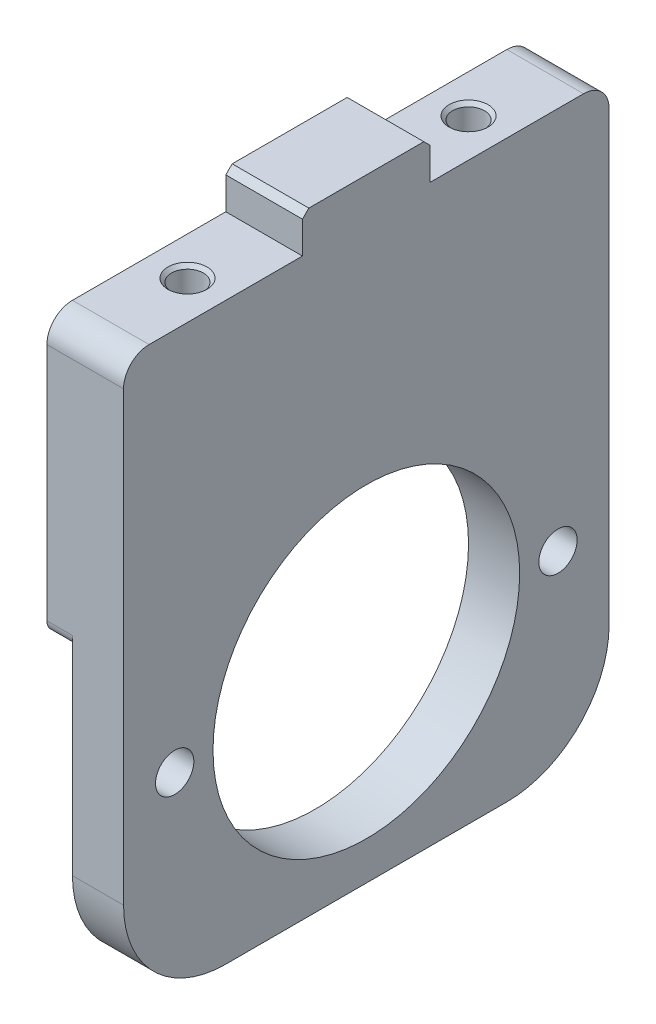
ISO-10303-21;
HEADER;
FILE_DESCRIPTION(('STEP AP214'),'2;1');
FILE_NAME('part.step','',(''),(''),'','','');
FILE_SCHEMA(('AUTOMOTIVE_DESIGN { 1 0 10303 214 1 1 1 1 }'));
ENDSEC;
DATA;
#1=APPLICATION_CONTEXT('core data for automotive mechanical design processes');
#2=APPLICATION_PROTOCOL_DEFINITION('international standard','automotive_design',2000,#1);
#3=PRODUCT_CONTEXT('',#1,'mechanical');
#4=PRODUCT('Part','Part','',(#3));
#5=PRODUCT_RELATED_PRODUCT_CATEGORY('part','',(#4));
#6=PRODUCT_DEFINITION_FORMATION('','',#4);
#7=PRODUCT_DEFINITION_CONTEXT('part definition',#1,'design');
#8=PRODUCT_DEFINITION('design','',#6,#7);
#9=PRODUCT_DEFINITION_SHAPE('','',#8);
#10=(LENGTH_UNIT() NAMED_UNIT(*) SI_UNIT(.MILLI.,.METRE.));
#11=(NAMED_UNIT(*) PLANE_ANGLE_UNIT() SI_UNIT($,.RADIAN.));
#12=(NAMED_UNIT(*) SI_UNIT($,.STERADIAN.) SOLID_ANGLE_UNIT());
#13=UNCERTAINTY_MEASURE_WITH_UNIT(LENGTH_MEASURE(1.E-05),#10,'distance_accuracy_value','');
#14=(GEOMETRIC_REPRESENTATION_CONTEXT(3) GLOBAL_UNCERTAINTY_ASSIGNED_CONTEXT((#13)) GLOBAL_UNIT_ASSIGNED_CONTEXT((#10,
#11,#12)) REPRESENTATION_CONTEXT('',''));
#15=CARTESIAN_POINT('',(0.,0.,0.));
#16=DIRECTION('',(0.,0.,1.));
#17=DIRECTION('',(1.,0.,0.));
#18=AXIS2_PLACEMENT_3D('',#15,#16,#17);
#19=CARTESIAN_POINT('',(6.,22.5,19.));
#20=DIRECTION('',(0.,-1.,0.));
#21=DIRECTION('',(0.,0.,-1.));
#22=AXIS2_PLACEMENT_3D('',#19,#20,#21);
#23=PLANE('',#22);
#24=CARTESIAN_POINT('',(3.,22.5,11.));
#25=DIRECTION('',(0.,1.,0.));
#26=DIRECTION('',(0.,0.,1.));
#27=AXIS2_PLACEMENT_3D('',#24,#25,#26);
#28=CIRCLE('',#27,1.525);
#29=CARTESIAN_POINT('',(3.,22.5,12.525));
#30=VERTEX_POINT('',#29);
#31=EDGE_CURVE('E181',#30,#30,#28,.T.);
#32=ORIENTED_EDGE('',*,*,#31,.F.);
#33=EDGE_LOOP('',(#32));
#34=FACE_BOUND('',#33,.T.);
#35=DIRECTION('',(0.,0.,1.));
#36=VECTOR('',#35,1.);
#37=CARTESIAN_POINT('',(6.,22.5,19.));
#38=LINE('',#37,#36);
#39=CARTESIAN_POINT('',(6.,22.5,4.99999999999999));
#40=VERTEX_POINT('',#39);
#41=CARTESIAN_POINT('',(6.,22.5,17.));
#42=VERTEX_POINT('',#41);
#43=EDGE_CURVE('E252',#40,#42,#38,.T.);
#44=ORIENTED_EDGE('',*,*,#43,.F.);
#45=DIRECTION('',(-1.,0.,0.));
#46=VECTOR('',#45,1.);
#47=CARTESIAN_POINT('',(16.4403065089105,22.5,4.99999999999999));
#48=LINE('',#47,#46);
#49=CARTESIAN_POINT('',(0.,22.5,4.99999999999999));
#50=VERTEX_POINT('',#49);
#51=EDGE_CURVE('E215',#40,#50,#48,.T.);
#52=ORIENTED_EDGE('',*,*,#51,.T.);
#53=DIRECTION('',(0.,0.,1.));
#54=VECTOR('',#53,1.);
#55=CARTESIAN_POINT('',(0.,22.5,19.));
#56=LINE('',#55,#54);
#57=CARTESIAN_POINT('',(0.,22.5,17.));
#58=VERTEX_POINT('',#57);
#59=EDGE_CURVE('E265',#50,#58,#56,.T.);
#60=ORIENTED_EDGE('',*,*,#59,.T.);
#61=DIRECTION('',(-1.,0.,0.));
#62=VECTOR('',#61,1.);
#63=CARTESIAN_POINT('',(6.,22.5,17.));
#64=LINE('',#63,#62);
#65=EDGE_CURVE('E310',#58,#42,#64,.F.);
#66=ORIENTED_EDGE('',*,*,#65,.T.);
#67=EDGE_LOOP('',(#44,#52,#60,#66));
#68=FACE_BOUND('',#67,.T.);
#69=ADVANCED_FACE('F39',(#34,#68),#23,.F.);
#70=CARTESIAN_POINT('',(6.,-22.5,19.));
#71=DIRECTION('',(0.,1.,0.));
#72=DIRECTION('',(0.,0.,1.));
#73=AXIS2_PLACEMENT_3D('',#70,#71,#72);
#74=PLANE('',#73);
#75=DIRECTION('',(0.,0.,1.));
#76=VECTOR('',#75,1.);
#77=CARTESIAN_POINT('',(2.,-22.5,-19.25));
#78=LINE('',#77,#76);
#79=CARTESIAN_POINT('',(2.,-22.5,-11.));
#80=VERTEX_POINT('',#79);
#81=CARTESIAN_POINT('',(2.,-22.5,11.));
#82=VERTEX_POINT('',#81);
#83=EDGE_CURVE('E222',#80,#82,#78,.T.);
#84=ORIENTED_EDGE('',*,*,#83,.F.);
#85=DIRECTION('',(-1.,0.,0.));
#86=VECTOR('',#85,1.);
#87=CARTESIAN_POINT('',(6.,-22.5,-11.));
#88=LINE('',#87,#86);
#89=CARTESIAN_POINT('',(6.,-22.5,-11.));
#90=VERTEX_POINT('',#89);
#91=EDGE_CURVE('E301',#80,#90,#88,.F.);
#92=ORIENTED_EDGE('',*,*,#91,.T.);
#93=DIRECTION('',(0.,0.,-1.));
#94=VECTOR('',#93,1.);
#95=CARTESIAN_POINT('',(6.,-22.5,19.));
#96=LINE('',#95,#94);
#97=CARTESIAN_POINT('',(6.,-22.5,11.));
#98=VERTEX_POINT('',#97);
#99=EDGE_CURVE('E259',#98,#90,#96,.T.);
#100=ORIENTED_EDGE('',*,*,#99,.F.);
#101=DIRECTION('',(-1.,0.,0.));
#102=VECTOR('',#101,1.);
#103=CARTESIAN_POINT('',(6.,-22.5,11.));
#104=LINE('',#103,#102);
#105=EDGE_CURVE('E298',#98,#82,#104,.T.);
#106=ORIENTED_EDGE('',*,*,#105,.T.);
#107=EDGE_LOOP('',(#84,#92,#100,#106));
#108=FACE_BOUND('',#107,.T.);
#109=ADVANCED_FACE('F408',(#108),#74,.F.);
#110=CARTESIAN_POINT('',(6.,-7.5,0.));
#111=DIRECTION('',(-1.,0.,0.));
#112=DIRECTION('',(0.,0.,1.));
#113=AXIS2_PLACEMENT_3D('',#110,#111,#112);
#114=CYLINDRICAL_SURFACE('',#113,12.);
#115=CARTESIAN_POINT('',(6.,-7.5,0.));
#116=DIRECTION('',(-1.,0.,0.));
#117=DIRECTION('',(0.,0.,1.));
#118=AXIS2_PLACEMENT_3D('',#115,#116,#117);
#119=CIRCLE('',#118,12.);
#120=CARTESIAN_POINT('',(6.,-7.5,12.));
#121=VERTEX_POINT('',#120);
#122=EDGE_CURVE('E243',#121,#121,#119,.T.);
#123=ORIENTED_EDGE('',*,*,#122,.F.);
#124=EDGE_LOOP('',(#123));
#125=FACE_BOUND('',#124,.T.);
#126=CARTESIAN_POINT('',(2.,-7.5,0.));
#127=DIRECTION('',(-1.,0.,0.));
#128=DIRECTION('',(0.,0.,1.));
#129=AXIS2_PLACEMENT_3D('',#126,#127,#128);
#130=CIRCLE('',#129,12.);
#131=CARTESIAN_POINT('',(2.,-7.5,12.));
#132=VERTEX_POINT('',#131);
#133=EDGE_CURVE('E231',#132,#132,#130,.F.);
#134=ORIENTED_EDGE('',*,*,#133,.F.);
#135=EDGE_LOOP('',(#134));
#136=FACE_BOUND('',#135,.T.);
#137=ADVANCED_FACE('F414',(#125,#136),#114,.F.);
#138=CARTESIAN_POINT('',(6.,-7.5,15.));
#139=DIRECTION('',(-1.,0.,0.));
#140=DIRECTION('',(0.,0.,1.));
#141=AXIS2_PLACEMENT_3D('',#138,#139,#140);
#142=CYLINDRICAL_SURFACE('',#141,1.5);
#143=CARTESIAN_POINT('',(6.,-7.5,15.));
#144=DIRECTION('',(-1.,0.,0.));
#145=DIRECTION('',(0.,0.,1.));
#146=AXIS2_PLACEMENT_3D('',#143,#144,#145);
#147=CIRCLE('',#146,1.5);
#148=CARTESIAN_POINT('',(6.,-7.5,16.5));
#149=VERTEX_POINT('',#148);
#150=EDGE_CURVE('E240',#149,#149,#147,.T.);
#151=ORIENTED_EDGE('',*,*,#150,.F.);
#152=EDGE_LOOP('',(#151));
#153=FACE_BOUND('',#152,.T.);
#154=CARTESIAN_POINT('',(2.,-7.5,15.));
#155=DIRECTION('',(-1.,0.,0.));
#156=DIRECTION('',(0.,0.,1.));
#157=AXIS2_PLACEMENT_3D('',#154,#155,#156);
#158=CIRCLE('',#157,1.5);
#159=CARTESIAN_POINT('',(2.,-7.5,16.5));
#160=VERTEX_POINT('',#159);
#161=EDGE_CURVE('E228',#160,#160,#158,.F.);
#162=ORIENTED_EDGE('',*,*,#161,.F.);
#163=EDGE_LOOP('',(#162));
#164=FACE_BOUND('',#163,.T.);
#165=ADVANCED_FACE('F458',(#153,#164),#142,.F.);
#166=CARTESIAN_POINT('',(6.,-7.50000000000001,-15.));
#167=DIRECTION('',(-1.,0.,0.));
#168=DIRECTION('',(0.,0.,1.));
#169=AXIS2_PLACEMENT_3D('',#166,#167,#168);
#170=CYLINDRICAL_SURFACE('',#169,1.5);
#171=CARTESIAN_POINT('',(6.,-7.50000000000001,-15.));
#172=DIRECTION('',(-1.,0.,0.));
#173=DIRECTION('',(0.,0.,-1.));
#174=AXIS2_PLACEMENT_3D('',#171,#172,#173);
#175=CIRCLE('',#174,1.5);
#176=CARTESIAN_POINT('',(6.,-7.50000000000001,-16.5));
#177=VERTEX_POINT('',#176);
#178=EDGE_CURVE('E239',#177,#177,#175,.T.);
#179=ORIENTED_EDGE('',*,*,#178,.F.);
#180=EDGE_LOOP('',(#179));
#181=FACE_BOUND('',#180,.T.);
#182=CARTESIAN_POINT('',(2.,-7.50000000000001,-15.));
#183=DIRECTION('',(-1.,0.,0.));
#184=DIRECTION('',(0.,0.,1.));
#185=AXIS2_PLACEMENT_3D('',#182,#183,#184);
#186=CIRCLE('',#185,1.5);
#187=CARTESIAN_POINT('',(2.,-7.50000000000001,-13.5));
#188=VERTEX_POINT('',#187);
#189=EDGE_CURVE('E225',#188,#188,#186,.F.);
#190=ORIENTED_EDGE('',*,*,#189,.F.);
#191=EDGE_LOOP('',(#190));
#192=FACE_BOUND('',#191,.T.);
#193=ADVANCED_FACE('F426',(#181,#192),#170,.F.);
#194=CARTESIAN_POINT('',(6.,22.5,-19.));
#195=DIRECTION('',(0.,0.,1.));
#196=DIRECTION('',(0.,-1.,0.));
#197=AXIS2_PLACEMENT_3D('',#194,#195,#196);
#198=PLANE('',#197);
#199=DIRECTION('',(0.,1.,0.));
#200=VECTOR('',#199,1.);
#201=CARTESIAN_POINT('',(0.,22.5,-19.));
#202=LINE('',#201,#200);
#203=CARTESIAN_POINT('',(0.,1.77698765763974,-19.));
#204=VERTEX_POINT('',#203);
#205=CARTESIAN_POINT('',(0.,20.5,-19.));
#206=VERTEX_POINT('',#205);
#207=EDGE_CURVE('E248',#204,#206,#202,.T.);
#208=ORIENTED_EDGE('',*,*,#207,.T.);
#209=DIRECTION('',(-1.,0.,0.));
#210=VECTOR('',#209,1.);
#211=CARTESIAN_POINT('',(6.,20.5,-19.));
#212=LINE('',#211,#210);
#213=CARTESIAN_POINT('',(6.,20.5,-19.));
#214=VERTEX_POINT('',#213);
#215=EDGE_CURVE('E321',#206,#214,#212,.F.);
#216=ORIENTED_EDGE('',*,*,#215,.T.);
#217=DIRECTION('',(0.,1.,0.));
#218=VECTOR('',#217,1.);
#219=CARTESIAN_POINT('',(6.,22.5,-19.));
#220=LINE('',#219,#218);
#221=CARTESIAN_POINT('',(6.,-14.5,-19.));
#222=VERTEX_POINT('',#221);
#223=EDGE_CURVE('E249',#222,#214,#220,.T.);
#224=ORIENTED_EDGE('',*,*,#223,.F.);
#225=DIRECTION('',(-1.,0.,0.));
#226=VECTOR('',#225,1.);
#227=CARTESIAN_POINT('',(6.,-14.5,-19.));
#228=LINE('',#227,#226);
#229=CARTESIAN_POINT('',(2.,-14.5,-19.));
#230=VERTEX_POINT('',#229);
#231=EDGE_CURVE('E291',#222,#230,#228,.T.);
#232=ORIENTED_EDGE('',*,*,#231,.T.);
#233=DIRECTION('',(0.,-1.,0.));
#234=VECTOR('',#233,1.);
#235=CARTESIAN_POINT('',(2.,22.5,-19.));
#236=LINE('',#235,#234);
#237=CARTESIAN_POINT('',(2.,1.77698765763973,-19.));
#238=VERTEX_POINT('',#237);
#239=EDGE_CURVE('E236',#238,#230,#236,.T.);
#240=ORIENTED_EDGE('',*,*,#239,.F.);
#241=DIRECTION('',(-1.,0.,0.));
#242=VECTOR('',#241,1.);
#243=CARTESIAN_POINT('',(6.,1.77698765763973,-19.));
#244=LINE('',#243,#242);
#245=EDGE_CURVE('E262',#238,#204,#244,.T.);
#246=ORIENTED_EDGE('',*,*,#245,.T.);
#247=EDGE_LOOP('',(#208,#216,#224,#232,#240,#246));
#248=FACE_BOUND('',#247,.T.);
#249=ADVANCED_FACE('F365',(#248),#198,.F.);
#250=CARTESIAN_POINT('',(3.,22.5,-11.));
#251=DIRECTION('',(0.,1.,0.));
#252=DIRECTION('',(0.,0.,1.));
#253=AXIS2_PLACEMENT_3D('',#250,#251,#252);
#254=CIRCLE('',#253,1.525);
#255=CARTESIAN_POINT('',(3.,22.5,-9.475));
#256=VERTEX_POINT('',#255);
#257=EDGE_CURVE('E188',#256,#256,#254,.T.);
#258=ORIENTED_EDGE('',*,*,#257,.F.);
#259=EDGE_LOOP('',(#258));
#260=FACE_BOUND('',#259,.T.);
#261=CARTESIAN_POINT('',(0.,22.5,-17.));
#262=VERTEX_POINT('',#261);
#263=CARTESIAN_POINT('',(0.,22.5,-4.99999999999999));
#264=VERTEX_POINT('',#263);
#265=EDGE_CURVE('E266',#262,#264,#56,.T.);
#266=ORIENTED_EDGE('',*,*,#265,.T.);
#267=DIRECTION('',(-1.,0.,0.));
#268=VECTOR('',#267,1.);
#269=CARTESIAN_POINT('',(16.4403065089105,22.5,-4.99999999999999));
#270=LINE('',#269,#268);
#271=CARTESIAN_POINT('',(6.,22.5,-4.99999999999999));
#272=VERTEX_POINT('',#271);
#273=EDGE_CURVE('E210',#272,#264,#270,.T.);
#274=ORIENTED_EDGE('',*,*,#273,.F.);
#275=CARTESIAN_POINT('',(6.,22.5,-17.));
#276=VERTEX_POINT('',#275);
#277=EDGE_CURVE('E254',#276,#272,#38,.T.);
#278=ORIENTED_EDGE('',*,*,#277,.F.);
#279=DIRECTION('',(-1.,0.,0.));
#280=VECTOR('',#279,1.);
#281=CARTESIAN_POINT('',(6.,22.5,-17.));
#282=LINE('',#281,#280);
#283=EDGE_CURVE('E313',#276,#262,#282,.T.);
#284=ORIENTED_EDGE('',*,*,#283,.T.);
#285=EDGE_LOOP('',(#266,#274,#278,#284));
#286=FACE_BOUND('',#285,.T.);
#287=ADVANCED_FACE('F356',(#260,#286),#23,.F.);
#288=CARTESIAN_POINT('',(6.,22.5,19.));
#289=DIRECTION('',(0.,0.,-1.));
#290=DIRECTION('',(0.,1.,0.));
#291=AXIS2_PLACEMENT_3D('',#288,#289,#290);
#292=PLANE('',#291);
#293=DIRECTION('',(0.,-1.,0.));
#294=VECTOR('',#293,1.);
#295=CARTESIAN_POINT('',(6.,22.5,19.));
#296=LINE('',#295,#294);
#297=CARTESIAN_POINT('',(6.,20.5,19.));
#298=VERTEX_POINT('',#297);
#299=CARTESIAN_POINT('',(6.,-14.5,19.));
#300=VERTEX_POINT('',#299);
#301=EDGE_CURVE('E257',#298,#300,#296,.T.);
#302=ORIENTED_EDGE('',*,*,#301,.F.);
#303=DIRECTION('',(-1.,0.,0.));
#304=VECTOR('',#303,1.);
#305=CARTESIAN_POINT('',(6.,20.5,19.));
#306=LINE('',#305,#304);
#307=CARTESIAN_POINT('',(0.,20.5,19.));
#308=VERTEX_POINT('',#307);
#309=EDGE_CURVE('E327',#298,#308,#306,.T.);
#310=ORIENTED_EDGE('',*,*,#309,.T.);
#311=DIRECTION('',(0.,-1.,0.));
#312=VECTOR('',#311,1.);
#313=CARTESIAN_POINT('',(0.,22.5,19.));
#314=LINE('',#313,#312);
#315=CARTESIAN_POINT('',(0.,1.77698765763973,19.));
#316=VERTEX_POINT('',#315);
#317=EDGE_CURVE('E253',#308,#316,#314,.T.);
#318=ORIENTED_EDGE('',*,*,#317,.T.);
#319=DIRECTION('',(-1.,0.,0.));
#320=VECTOR('',#319,1.);
#321=CARTESIAN_POINT('',(6.,1.77698765763973,19.));
#322=LINE('',#321,#320);
#323=CARTESIAN_POINT('',(2.,1.77698765763973,19.));
#324=VERTEX_POINT('',#323);
#325=EDGE_CURVE('E283',#316,#324,#322,.F.);
#326=ORIENTED_EDGE('',*,*,#325,.T.);
#327=DIRECTION('',(0.,1.,0.));
#328=VECTOR('',#327,1.);
#329=CARTESIAN_POINT('',(2.,22.5,19.));
#330=LINE('',#329,#328);
#331=CARTESIAN_POINT('',(2.,-14.5,19.));
#332=VERTEX_POINT('',#331);
#333=EDGE_CURVE('E234',#332,#324,#330,.T.);
#334=ORIENTED_EDGE('',*,*,#333,.F.);
#335=DIRECTION('',(-1.,0.,0.));
#336=VECTOR('',#335,1.);
#337=CARTESIAN_POINT('',(6.,-14.5,19.));
#338=LINE('',#337,#336);
#339=EDGE_CURVE('E307',#332,#300,#338,.F.);
#340=ORIENTED_EDGE('',*,*,#339,.T.);
#341=EDGE_LOOP('',(#302,#310,#318,#326,#334,#340));
#342=FACE_BOUND('',#341,.T.);
#343=ADVANCED_FACE('F385',(#342),#292,.F.);
#344=CARTESIAN_POINT('',(6.,0.,0.));
#345=DIRECTION('',(1.,0.,0.));
#346=DIRECTION('',(0.,0.,-1.));
#347=AXIS2_PLACEMENT_3D('',#344,#345,#346);
#348=PLANE('',#347);
#349=ORIENTED_EDGE('',*,*,#178,.T.);
#350=EDGE_LOOP('',(#349));
#351=FACE_BOUND('',#350,.T.);
#352=ORIENTED_EDGE('',*,*,#150,.T.);
#353=EDGE_LOOP('',(#352));
#354=FACE_BOUND('',#353,.T.);
#355=ORIENTED_EDGE('',*,*,#122,.T.);
#356=EDGE_LOOP('',(#355));
#357=FACE_BOUND('',#356,.T.);
#358=DIRECTION('',(0.,-1.,0.));
#359=VECTOR('',#358,1.);
#360=CARTESIAN_POINT('',(6.,22.5,-4.99999999999999));
#361=LINE('',#360,#359);
#362=CARTESIAN_POINT('',(6.,25.,-4.99999999999999));
#363=VERTEX_POINT('',#362);
#364=EDGE_CURVE('E208',#363,#272,#361,.T.);
#365=ORIENTED_EDGE('',*,*,#364,.F.);
#366=DIRECTION('',(0.,-0.707106781186548,-0.707106781186548));
#367=VECTOR('',#366,1.);
#368=CARTESIAN_POINT('',(6.,15.,-15.));
#369=LINE('',#368,#367);
#370=CARTESIAN_POINT('',(6.,25.5,-4.49999999999999));
#371=VERTEX_POINT('',#370);
#372=EDGE_CURVE('E47',#363,#371,#369,.F.);
#373=ORIENTED_EDGE('',*,*,#372,.T.);
#374=DIRECTION('',(0.,0.,-1.));
#375=VECTOR('',#374,1.);
#376=CARTESIAN_POINT('',(6.,25.5,-4.99999999999999));
#377=LINE('',#376,#375);
#378=CARTESIAN_POINT('',(6.,25.5,4.50000000000001));
#379=VERTEX_POINT('',#378);
#380=EDGE_CURVE('E207',#379,#371,#377,.T.);
#381=ORIENTED_EDGE('',*,*,#380,.F.);
#382=DIRECTION('',(0.,0.707106781186543,-0.707106781186552));
#383=VECTOR('',#382,1.);
#384=CARTESIAN_POINT('',(6.,15.0000000000002,15.));
#385=LINE('',#384,#383);
#386=CARTESIAN_POINT('',(6.,25.,5.00000000000001));
#387=VERTEX_POINT('',#386);
#388=EDGE_CURVE('E54',#379,#387,#385,.F.);
#389=ORIENTED_EDGE('',*,*,#388,.T.);
#390=DIRECTION('',(0.,1.,0.));
#391=VECTOR('',#390,1.);
#392=CARTESIAN_POINT('',(6.,22.5,4.99999999999999));
#393=LINE('',#392,#391);
#394=EDGE_CURVE('E200',#40,#387,#393,.T.);
#395=ORIENTED_EDGE('',*,*,#394,.F.);
#396=ORIENTED_EDGE('',*,*,#43,.T.);
#397=CARTESIAN_POINT('',(6.,20.5,17.));
#398=DIRECTION('',(1.,0.,0.));
#399=DIRECTION('',(0.,0.,-1.));
#400=AXIS2_PLACEMENT_3D('',#397,#398,#399);
#401=CIRCLE('',#400,2.);
#402=EDGE_CURVE('E323',#42,#298,#401,.T.);
#403=ORIENTED_EDGE('',*,*,#402,.T.);
#404=ORIENTED_EDGE('',*,*,#301,.T.);
#405=CARTESIAN_POINT('',(6.,-14.5,11.));
#406=DIRECTION('',(1.,0.,0.));
#407=DIRECTION('',(0.,0.,-1.));
#408=AXIS2_PLACEMENT_3D('',#405,#406,#407);
#409=CIRCLE('',#408,8.);
#410=EDGE_CURVE('E303',#300,#98,#409,.T.);
#411=ORIENTED_EDGE('',*,*,#410,.T.);
#412=ORIENTED_EDGE('',*,*,#99,.T.);
#413=CARTESIAN_POINT('',(6.,-14.5,-11.));
#414=DIRECTION('',(1.,0.,0.));
#415=DIRECTION('',(0.,0.,-1.));
#416=AXIS2_PLACEMENT_3D('',#413,#414,#415);
#417=CIRCLE('',#416,8.);
#418=EDGE_CURVE('E305',#90,#222,#417,.T.);
#419=ORIENTED_EDGE('',*,*,#418,.T.);
#420=ORIENTED_EDGE('',*,*,#223,.T.);
#421=CARTESIAN_POINT('',(6.,20.5,-17.));
#422=DIRECTION('',(1.,0.,0.));
#423=DIRECTION('',(0.,0.,-1.));
#424=AXIS2_PLACEMENT_3D('',#421,#422,#423);
#425=CIRCLE('',#424,2.);
#426=EDGE_CURVE('E325',#214,#276,#425,.T.);
#427=ORIENTED_EDGE('',*,*,#426,.T.);
#428=ORIENTED_EDGE('',*,*,#277,.T.);
#429=EDGE_LOOP('',(#365,#373,#381,#389,#395,#396,#403,#404,#411,#412,#419,#420,#427,#428));
#430=FACE_BOUND('',#429,.T.);
#431=ADVANCED_FACE('F341',(#351,#354,#357,#430),#348,.T.);
#432=CARTESIAN_POINT('',(0.,0.,0.));
#433=DIRECTION('',(1.,0.,0.));
#434=DIRECTION('',(0.,0.,-1.));
#435=AXIS2_PLACEMENT_3D('',#432,#433,#434);
#436=PLANE('',#435);
#437=DIRECTION('',(0.,0.,-1.));
#438=VECTOR('',#437,1.);
#439=CARTESIAN_POINT('',(0.,25.5,-4.99999999999999));
#440=LINE('',#439,#438);
#441=CARTESIAN_POINT('',(0.,25.5,4.50000000000001));
#442=VERTEX_POINT('',#441);
#443=CARTESIAN_POINT('',(0.,25.5,-4.49999999999999));
#444=VERTEX_POINT('',#443);
#445=EDGE_CURVE('E201',#442,#444,#440,.T.);
#446=ORIENTED_EDGE('',*,*,#445,.T.);
#447=DIRECTION('',(0.,0.707106781186548,0.707106781186548));
#448=VECTOR('',#447,1.);
#449=CARTESIAN_POINT('',(0.,25.5,-4.49999999999999));
#450=LINE('',#449,#448);
#451=CARTESIAN_POINT('',(0.,25.,-4.99999999999999));
#452=VERTEX_POINT('',#451);
#453=EDGE_CURVE('E337',#444,#452,#450,.F.);
#454=ORIENTED_EDGE('',*,*,#453,.T.);
#455=DIRECTION('',(0.,-1.,0.));
#456=VECTOR('',#455,1.);
#457=CARTESIAN_POINT('',(0.,22.5,-4.99999999999999));
#458=LINE('',#457,#456);
#459=EDGE_CURVE('E198',#452,#264,#458,.T.);
#460=ORIENTED_EDGE('',*,*,#459,.T.);
#461=ORIENTED_EDGE('',*,*,#265,.F.);
#462=CARTESIAN_POINT('',(0.,20.5,-17.));
#463=DIRECTION('',(1.,0.,0.));
#464=DIRECTION('',(0.,0.,-1.));
#465=AXIS2_PLACEMENT_3D('',#462,#463,#464);
#466=CIRCLE('',#465,2.);
#467=EDGE_CURVE('E319',#262,#206,#466,.F.);
#468=ORIENTED_EDGE('',*,*,#467,.T.);
#469=ORIENTED_EDGE('',*,*,#207,.F.);
#470=CARTESIAN_POINT('',(0.,1.77698765763973,-18.));
#471=DIRECTION('',(1.,0.,0.));
#472=DIRECTION('',(0.,0.,-1.));
#473=AXIS2_PLACEMENT_3D('',#470,#471,#472);
#474=CIRCLE('',#473,1.);
#475=CARTESIAN_POINT('',(0.,1.31886481034888,-17.1111111111111));
#476=VERTEX_POINT('',#475);
#477=EDGE_CURVE('E277',#204,#476,#474,.F.);
#478=ORIENTED_EDGE('',*,*,#477,.T.);
#479=CARTESIAN_POINT('',(0.,-7.5,0.));
#480=DIRECTION('',(-1.,0.,0.));
#481=DIRECTION('',(0.,0.,1.));
#482=AXIS2_PLACEMENT_3D('',#479,#480,#481);
#483=CIRCLE('',#482,19.25);
#484=CARTESIAN_POINT('',(0.,1.31886481034888,17.1111111111111));
#485=VERTEX_POINT('',#484);
#486=EDGE_CURVE('E218',#485,#476,#483,.T.);
#487=ORIENTED_EDGE('',*,*,#486,.F.);
#488=CARTESIAN_POINT('',(0.,1.77698765763973,18.));
#489=DIRECTION('',(1.,0.,0.));
#490=DIRECTION('',(0.,0.,-1.));
#491=AXIS2_PLACEMENT_3D('',#488,#489,#490);
#492=CIRCLE('',#491,1.);
#493=EDGE_CURVE('E274',#485,#316,#492,.F.);
#494=ORIENTED_EDGE('',*,*,#493,.T.);
#495=ORIENTED_EDGE('',*,*,#317,.F.);
#496=CARTESIAN_POINT('',(0.,20.5,17.));
#497=DIRECTION('',(1.,0.,0.));
#498=DIRECTION('',(0.,0.,-1.));
#499=AXIS2_PLACEMENT_3D('',#496,#497,#498);
#500=CIRCLE('',#499,2.);
#501=EDGE_CURVE('E316',#308,#58,#500,.F.);
#502=ORIENTED_EDGE('',*,*,#501,.T.);
#503=ORIENTED_EDGE('',*,*,#59,.F.);
#504=DIRECTION('',(0.,1.,0.));
#505=VECTOR('',#504,1.);
#506=CARTESIAN_POINT('',(0.,22.5,4.99999999999999));
#507=LINE('',#506,#505);
#508=CARTESIAN_POINT('',(0.,25.,5.00000000000001));
#509=VERTEX_POINT('',#508);
#510=EDGE_CURVE('E197',#50,#509,#507,.T.);
#511=ORIENTED_EDGE('',*,*,#510,.T.);
#512=DIRECTION('',(0.,-0.707106781186543,0.707106781186552));
#513=VECTOR('',#512,1.);
#514=CARTESIAN_POINT('',(0.,25.,5.00000000000001));
#515=LINE('',#514,#513);
#516=EDGE_CURVE('E335',#509,#442,#515,.F.);
#517=ORIENTED_EDGE('',*,*,#516,.T.);
#518=EDGE_LOOP('',(#446,#454,#460,#461,#468,#469,#478,#487,#494,#495,#502,#503,#511,#517));
#519=FACE_BOUND('',#518,.T.);
#520=ADVANCED_FACE('F350',(#519),#436,.F.);
#521=CARTESIAN_POINT('',(2.,-7.5,0.));
#522=DIRECTION('',(-1.,0.,0.));
#523=DIRECTION('',(0.,0.,1.));
#524=AXIS2_PLACEMENT_3D('',#521,#522,#523);
#525=CYLINDRICAL_SURFACE('',#524,19.25);
#526=ORIENTED_EDGE('',*,*,#486,.T.);
#527=DIRECTION('',(-1.,0.,0.));
#528=VECTOR('',#527,1.);
#529=CARTESIAN_POINT('',(2.,1.31886481034888,-17.1111111111111));
#530=LINE('',#529,#528);
#531=CARTESIAN_POINT('',(2.,1.31886481034888,-17.1111111111111));
#532=VERTEX_POINT('',#531);
#533=EDGE_CURVE('E281',#476,#532,#530,.F.);
#534=ORIENTED_EDGE('',*,*,#533,.T.);
#535=CARTESIAN_POINT('',(2.,-7.5,0.));
#536=DIRECTION('',(-1.,0.,0.));
#537=DIRECTION('',(0.,0.,1.));
#538=AXIS2_PLACEMENT_3D('',#535,#536,#537);
#539=CIRCLE('',#538,19.25);
#540=CARTESIAN_POINT('',(2.,1.31886481034888,17.1111111111111));
#541=VERTEX_POINT('',#540);
#542=EDGE_CURVE('E219',#541,#532,#539,.T.);
#543=ORIENTED_EDGE('',*,*,#542,.F.);
#544=DIRECTION('',(-1.,0.,0.));
#545=VECTOR('',#544,1.);
#546=CARTESIAN_POINT('',(2.,1.31886481034888,17.1111111111111));
#547=LINE('',#546,#545);
#548=EDGE_CURVE('E279',#541,#485,#547,.T.);
#549=ORIENTED_EDGE('',*,*,#548,.T.);
#550=EDGE_LOOP('',(#526,#534,#543,#549));
#551=FACE_BOUND('',#550,.T.);
#552=ADVANCED_FACE('F374',(#551),#525,.F.);
#553=CARTESIAN_POINT('',(2.,-7.5,0.));
#554=DIRECTION('',(-1.,0.,0.));
#555=DIRECTION('',(0.,0.,1.));
#556=AXIS2_PLACEMENT_3D('',#553,#554,#555);
#557=PLANE('',#556);
#558=ORIENTED_EDGE('',*,*,#189,.T.);
#559=EDGE_LOOP('',(#558));
#560=FACE_BOUND('',#559,.T.);
#561=ORIENTED_EDGE('',*,*,#161,.T.);
#562=EDGE_LOOP('',(#561));
#563=FACE_BOUND('',#562,.T.);
#564=ORIENTED_EDGE('',*,*,#133,.T.);
#565=EDGE_LOOP('',(#564));
#566=FACE_BOUND('',#565,.T.);
#567=ORIENTED_EDGE('',*,*,#239,.T.);
#568=CARTESIAN_POINT('',(2.,-14.5,-11.));
#569=DIRECTION('',(-1.,0.,0.));
#570=DIRECTION('',(0.,0.,1.));
#571=AXIS2_PLACEMENT_3D('',#568,#569,#570);
#572=CIRCLE('',#571,8.);
#573=EDGE_CURVE('E296',#230,#80,#572,.T.);
#574=ORIENTED_EDGE('',*,*,#573,.T.);
#575=ORIENTED_EDGE('',*,*,#83,.T.);
#576=CARTESIAN_POINT('',(2.,-14.5,11.));
#577=DIRECTION('',(-1.,0.,0.));
#578=DIRECTION('',(0.,0.,1.));
#579=AXIS2_PLACEMENT_3D('',#576,#577,#578);
#580=CIRCLE('',#579,8.);
#581=EDGE_CURVE('E294',#82,#332,#580,.T.);
#582=ORIENTED_EDGE('',*,*,#581,.T.);
#583=ORIENTED_EDGE('',*,*,#333,.T.);
#584=CARTESIAN_POINT('',(2.,1.77698765763973,18.));
#585=DIRECTION('',(-1.,0.,0.));
#586=DIRECTION('',(0.,0.,1.));
#587=AXIS2_PLACEMENT_3D('',#584,#585,#586);
#588=CIRCLE('',#587,1.);
#589=EDGE_CURVE('E289',#324,#541,#588,.F.);
#590=ORIENTED_EDGE('',*,*,#589,.T.);
#591=ORIENTED_EDGE('',*,*,#542,.T.);
#592=CARTESIAN_POINT('',(2.,1.77698765763973,-18.));
#593=DIRECTION('',(-1.,0.,0.));
#594=DIRECTION('',(0.,0.,1.));
#595=AXIS2_PLACEMENT_3D('',#592,#593,#594);
#596=CIRCLE('',#595,1.);
#597=EDGE_CURVE('E286',#532,#238,#596,.F.);
#598=ORIENTED_EDGE('',*,*,#597,.T.);
#599=EDGE_LOOP('',(#567,#574,#575,#582,#583,#590,#591,#598));
#600=FACE_BOUND('',#599,.T.);
#601=ADVANCED_FACE('F452',(#560,#563,#566,#600),#557,.T.);
#602=CARTESIAN_POINT('',(2.,1.77698765763973,-18.));
#603=DIRECTION('',(-1.,0.,0.));
#604=DIRECTION('',(0.,0.,1.));
#605=AXIS2_PLACEMENT_3D('',#602,#603,#604);
#606=CYLINDRICAL_SURFACE('',#605,1.);
#607=ORIENTED_EDGE('',*,*,#597,.F.);
#608=ORIENTED_EDGE('',*,*,#533,.F.);
#609=ORIENTED_EDGE('',*,*,#477,.F.);
#610=ORIENTED_EDGE('',*,*,#245,.F.);
#611=EDGE_LOOP('',(#607,#608,#609,#610));
#612=FACE_BOUND('',#611,.T.);
#613=ADVANCED_FACE('F369',(#612),#606,.T.);
#614=CARTESIAN_POINT('',(2.,1.77698765763973,18.));
#615=DIRECTION('',(-1.,0.,0.));
#616=DIRECTION('',(0.,0.,1.));
#617=AXIS2_PLACEMENT_3D('',#614,#615,#616);
#618=CYLINDRICAL_SURFACE('',#617,1.);
#619=ORIENTED_EDGE('',*,*,#493,.F.);
#620=ORIENTED_EDGE('',*,*,#548,.F.);
#621=ORIENTED_EDGE('',*,*,#589,.F.);
#622=ORIENTED_EDGE('',*,*,#325,.F.);
#623=EDGE_LOOP('',(#619,#620,#621,#622));
#624=FACE_BOUND('',#623,.T.);
#625=ADVANCED_FACE('F379',(#624),#618,.T.);
#626=CARTESIAN_POINT('',(6.,-14.5,-11.));
#627=DIRECTION('',(-1.,0.,0.));
#628=DIRECTION('',(0.,0.,1.));
#629=AXIS2_PLACEMENT_3D('',#626,#627,#628);
#630=CYLINDRICAL_SURFACE('',#629,8.);
#631=ORIENTED_EDGE('',*,*,#418,.F.);
#632=ORIENTED_EDGE('',*,*,#91,.F.);
#633=ORIENTED_EDGE('',*,*,#573,.F.);
#634=ORIENTED_EDGE('',*,*,#231,.F.);
#635=EDGE_LOOP('',(#631,#632,#633,#634));
#636=FACE_BOUND('',#635,.T.);
#637=ADVANCED_FACE('F500',(#636),#630,.T.);
#638=CARTESIAN_POINT('',(6.,-14.5,11.));
#639=DIRECTION('',(-1.,0.,0.));
#640=DIRECTION('',(0.,0.,1.));
#641=AXIS2_PLACEMENT_3D('',#638,#639,#640);
#642=CYLINDRICAL_SURFACE('',#641,8.);
#643=ORIENTED_EDGE('',*,*,#410,.F.);
#644=ORIENTED_EDGE('',*,*,#339,.F.);
#645=ORIENTED_EDGE('',*,*,#581,.F.);
#646=ORIENTED_EDGE('',*,*,#105,.F.);
#647=EDGE_LOOP('',(#643,#644,#645,#646));
#648=FACE_BOUND('',#647,.T.);
#649=ADVANCED_FACE('F506',(#648),#642,.T.);
#650=CARTESIAN_POINT('',(6.,20.5,-17.));
#651=DIRECTION('',(-1.,0.,0.));
#652=DIRECTION('',(0.,0.,1.));
#653=AXIS2_PLACEMENT_3D('',#650,#651,#652);
#654=CYLINDRICAL_SURFACE('',#653,2.);
#655=ORIENTED_EDGE('',*,*,#426,.F.);
#656=ORIENTED_EDGE('',*,*,#215,.F.);
#657=ORIENTED_EDGE('',*,*,#467,.F.);
#658=ORIENTED_EDGE('',*,*,#283,.F.);
#659=EDGE_LOOP('',(#655,#656,#657,#658));
#660=FACE_BOUND('',#659,.T.);
#661=ADVANCED_FACE('F362',(#660),#654,.T.);
#662=CARTESIAN_POINT('',(6.,20.5,17.));
#663=DIRECTION('',(-1.,0.,0.));
#664=DIRECTION('',(0.,0.,1.));
#665=AXIS2_PLACEMENT_3D('',#662,#663,#664);
#666=CYLINDRICAL_SURFACE('',#665,2.);
#667=ORIENTED_EDGE('',*,*,#402,.F.);
#668=ORIENTED_EDGE('',*,*,#65,.F.);
#669=ORIENTED_EDGE('',*,*,#501,.F.);
#670=ORIENTED_EDGE('',*,*,#309,.F.);
#671=EDGE_LOOP('',(#667,#668,#669,#670));
#672=FACE_BOUND('',#671,.T.);
#673=ADVANCED_FACE('F390',(#672),#666,.T.);
#674=CARTESIAN_POINT('',(16.4403065089105,22.5,4.99999999999999));
#675=DIRECTION('',(0.,0.,1.));
#676=DIRECTION('',(0.,-1.,0.));
#677=AXIS2_PLACEMENT_3D('',#674,#675,#676);
#678=PLANE('',#677);
#679=ORIENTED_EDGE('',*,*,#394,.T.);
#680=DIRECTION('',(-1.,0.,0.));
#681=VECTOR('',#680,1.);
#682=CARTESIAN_POINT('',(16.4403065089105,25.,5.00000000000001));
#683=LINE('',#682,#681);
#684=EDGE_CURVE('E11',#387,#509,#683,.T.);
#685=ORIENTED_EDGE('',*,*,#684,.T.);
#686=ORIENTED_EDGE('',*,*,#510,.F.);
#687=ORIENTED_EDGE('',*,*,#51,.F.);
#688=EDGE_LOOP('',(#679,#685,#686,#687));
#689=FACE_BOUND('',#688,.T.);
#690=ADVANCED_FACE('F395',(#689),#678,.T.);
#691=CARTESIAN_POINT('',(16.4403065089105,25.5,-4.99999999999999));
#692=DIRECTION('',(0.,1.,0.));
#693=DIRECTION('',(0.,0.,1.));
#694=AXIS2_PLACEMENT_3D('',#691,#692,#693);
#695=PLANE('',#694);
#696=ORIENTED_EDGE('',*,*,#380,.T.);
#697=DIRECTION('',(-1.,0.,0.));
#698=VECTOR('',#697,1.);
#699=CARTESIAN_POINT('',(16.4403065089105,25.5,-4.49999999999999));
#700=LINE('',#699,#698);
#701=EDGE_CURVE('E332',#371,#444,#700,.T.);
#702=ORIENTED_EDGE('',*,*,#701,.T.);
#703=ORIENTED_EDGE('',*,*,#445,.F.);
#704=DIRECTION('',(1.,0.,0.));
#705=VECTOR('',#704,1.);
#706=CARTESIAN_POINT('',(16.4403065089105,25.5,4.50000000000001));
#707=LINE('',#706,#705);
#708=EDGE_CURVE('E330',#442,#379,#707,.T.);
#709=ORIENTED_EDGE('',*,*,#708,.T.);
#710=EDGE_LOOP('',(#696,#702,#703,#709));
#711=FACE_BOUND('',#710,.T.);
#712=ADVANCED_FACE('F345',(#711),#695,.T.);
#713=CARTESIAN_POINT('',(16.4403065089105,22.5,-4.99999999999999));
#714=DIRECTION('',(0.,0.,-1.));
#715=DIRECTION('',(-1.,0.,0.));
#716=AXIS2_PLACEMENT_3D('',#713,#714,#715);
#717=PLANE('',#716);
#718=ORIENTED_EDGE('',*,*,#459,.F.);
#719=DIRECTION('',(1.,0.,0.));
#720=VECTOR('',#719,1.);
#721=CARTESIAN_POINT('',(16.4403065089105,25.,-4.99999999999999));
#722=LINE('',#721,#720);
#723=EDGE_CURVE('E62',#452,#363,#722,.T.);
#724=ORIENTED_EDGE('',*,*,#723,.T.);
#725=ORIENTED_EDGE('',*,*,#364,.T.);
#726=ORIENTED_EDGE('',*,*,#273,.T.);
#727=EDGE_LOOP('',(#718,#724,#725,#726));
#728=FACE_BOUND('',#727,.T.);
#729=ADVANCED_FACE('F352',(#728),#717,.T.);
#730=CARTESIAN_POINT('',(16.4403065089105,25.5,-4.49999999999999));
#731=DIRECTION('',(0.,-0.707106781186547,0.707106781186547));
#732=DIRECTION('',(-1.,0.,0.));
#733=AXIS2_PLACEMENT_3D('',#730,#731,#732);
#734=PLANE('',#733);
#735=ORIENTED_EDGE('',*,*,#372,.F.);
#736=ORIENTED_EDGE('',*,*,#723,.F.);
#737=ORIENTED_EDGE('',*,*,#453,.F.);
#738=ORIENTED_EDGE('',*,*,#701,.F.);
#739=EDGE_LOOP('',(#735,#736,#737,#738));
#740=FACE_BOUND('',#739,.T.);
#741=ADVANCED_FACE('F348',(#740),#734,.F.);
#742=CARTESIAN_POINT('',(16.4403065089105,25.,5.00000000000001));
#743=DIRECTION('',(0.,-0.707106781186552,-0.707106781186543));
#744=DIRECTION('',(-1.,0.,0.));
#745=AXIS2_PLACEMENT_3D('',#742,#743,#744);
#746=PLANE('',#745);
#747=ORIENTED_EDGE('',*,*,#388,.F.);
#748=ORIENTED_EDGE('',*,*,#708,.F.);
#749=ORIENTED_EDGE('',*,*,#516,.F.);
#750=ORIENTED_EDGE('',*,*,#684,.F.);
#751=EDGE_LOOP('',(#747,#748,#749,#750));
#752=FACE_BOUND('',#751,.T.);
#753=ADVANCED_FACE('F41',(#752),#746,.F.);
#754=CARTESIAN_POINT('',(3.,15.,11.));
#755=DIRECTION('',(0.,1.,0.));
#756=DIRECTION('',(0.,0.,1.));
#757=AXIS2_PLACEMENT_3D('',#754,#755,#756);
#758=CONICAL_SURFACE('',#757,1.24999999999999,1.02974425867665);
#759=CARTESIAN_POINT('',(3.,14.2489242262156,11.));
#760=VERTEX_POINT('',#759);
#761=VERTEX_LOOP('',#760);
#762=FACE_BOUND('',#761,.T.);
#763=CARTESIAN_POINT('',(3.,15.,11.));
#764=DIRECTION('',(0.,1.,0.));
#765=DIRECTION('',(0.,0.,1.));
#766=AXIS2_PLACEMENT_3D('',#763,#764,#765);
#767=CIRCLE('',#766,1.24999999999999);
#768=CARTESIAN_POINT('',(3.,15.,12.25));
#769=VERTEX_POINT('',#768);
#770=EDGE_CURVE('E194',#769,#769,#767,.T.);
#771=ORIENTED_EDGE('',*,*,#770,.T.);
#772=EDGE_LOOP('',(#771));
#773=FACE_BOUND('',#772,.T.);
#774=ADVANCED_FACE('F399',(#762,#773),#758,.F.);
#775=CARTESIAN_POINT('',(3.,22.5,11.));
#776=DIRECTION('',(0.,1.,0.));
#777=DIRECTION('',(0.,0.,1.));
#778=AXIS2_PLACEMENT_3D('',#775,#776,#777);
#779=CYLINDRICAL_SURFACE('',#778,1.24999999999999);
#780=ORIENTED_EDGE('',*,*,#770,.F.);
#781=EDGE_LOOP('',(#780));
#782=FACE_BOUND('',#781,.T.);
#783=CARTESIAN_POINT('',(3.,22.225,11.));
#784=DIRECTION('',(0.,1.,0.));
#785=DIRECTION('',(0.,0.,1.));
#786=AXIS2_PLACEMENT_3D('',#783,#784,#785);
#787=CIRCLE('',#786,1.25);
#788=CARTESIAN_POINT('',(3.,22.225,12.25));
#789=VERTEX_POINT('',#788);
#790=EDGE_CURVE('E185',#789,#789,#787,.T.);
#791=ORIENTED_EDGE('',*,*,#790,.T.);
#792=EDGE_LOOP('',(#791));
#793=FACE_BOUND('',#792,.T.);
#794=ADVANCED_FACE('F404',(#782,#793),#779,.F.);
#795=CARTESIAN_POINT('',(3.,22.5,11.));
#796=DIRECTION('',(0.,1.,0.));
#797=DIRECTION('',(0.,0.,1.));
#798=AXIS2_PLACEMENT_3D('',#795,#796,#797);
#799=CONICAL_SURFACE('',#798,1.525,0.785398163397442);
#800=ORIENTED_EDGE('',*,*,#790,.F.);
#801=EDGE_LOOP('',(#800));
#802=FACE_BOUND('',#801,.T.);
#803=ORIENTED_EDGE('',*,*,#31,.T.);
#804=EDGE_LOOP('',(#803));
#805=FACE_BOUND('',#804,.T.);
#806=ADVANCED_FACE('F175',(#802,#805),#799,.F.);
#807=CARTESIAN_POINT('',(3.,15.,-11.));
#808=DIRECTION('',(0.,1.,0.));
#809=DIRECTION('',(0.,0.,1.));
#810=AXIS2_PLACEMENT_3D('',#807,#808,#809);
#811=CONICAL_SURFACE('',#810,1.24999999999999,1.02974425867665);
#812=CARTESIAN_POINT('',(3.,14.2489242262156,-11.));
#813=VERTEX_POINT('',#812);
#814=VERTEX_LOOP('',#813);
#815=FACE_BOUND('',#814,.T.);
#816=CARTESIAN_POINT('',(3.,15.,-11.));
#817=DIRECTION('',(0.,1.,0.));
#818=DIRECTION('',(0.,0.,1.));
#819=AXIS2_PLACEMENT_3D('',#816,#817,#818);
#820=CIRCLE('',#819,1.24999999999999);
#821=CARTESIAN_POINT('',(3.,15.,-9.75000000000001));
#822=VERTEX_POINT('',#821);
#823=EDGE_CURVE('E179',#822,#822,#820,.T.);
#824=ORIENTED_EDGE('',*,*,#823,.T.);
#825=EDGE_LOOP('',(#824));
#826=FACE_BOUND('',#825,.T.);
#827=ADVANCED_FACE('F171',(#815,#826),#811,.F.);
#828=CARTESIAN_POINT('',(3.,22.5,-11.));
#829=DIRECTION('',(0.,1.,0.));
#830=DIRECTION('',(0.,0.,1.));
#831=AXIS2_PLACEMENT_3D('',#828,#829,#830);
#832=CYLINDRICAL_SURFACE('',#831,1.24999999999999);
#833=ORIENTED_EDGE('',*,*,#823,.F.);
#834=EDGE_LOOP('',(#833));
#835=FACE_BOUND('',#834,.T.);
#836=CARTESIAN_POINT('',(3.,22.225,-11.));
#837=DIRECTION('',(0.,1.,0.));
#838=DIRECTION('',(0.,0.,1.));
#839=AXIS2_PLACEMENT_3D('',#836,#837,#838);
#840=CIRCLE('',#839,1.25);
#841=CARTESIAN_POINT('',(3.,22.225,-9.75));
#842=VERTEX_POINT('',#841);
#843=EDGE_CURVE('E182',#842,#842,#840,.T.);
#844=ORIENTED_EDGE('',*,*,#843,.T.);
#845=EDGE_LOOP('',(#844));
#846=FACE_BOUND('',#845,.T.);
#847=ADVANCED_FACE('F174',(#835,#846),#832,.F.);
#848=CARTESIAN_POINT('',(3.,22.5,-11.));
#849=DIRECTION('',(0.,1.,0.));
#850=DIRECTION('',(0.,0.,1.));
#851=AXIS2_PLACEMENT_3D('',#848,#849,#850);
#852=CONICAL_SURFACE('',#851,1.525,0.785398163397442);
#853=ORIENTED_EDGE('',*,*,#843,.F.);
#854=EDGE_LOOP('',(#853));
#855=FACE_BOUND('',#854,.T.);
#856=ORIENTED_EDGE('',*,*,#257,.T.);
#857=EDGE_LOOP('',(#856));
#858=FACE_BOUND('',#857,.T.);
#859=ADVANCED_FACE('F430',(#855,#858),#852,.F.);
#860=CLOSED_SHELL('',(#69,#109,#137,#165,#193,#249,#287,#343,#431,#520,#552,#601,#613,#625,#637,
#649,#661,#673,#690,#712,#729,#741,#753,#774,#794,#806,#827,#847,#859));
#861=MANIFOLD_SOLID_BREP('B2',#860);
#862=ADVANCED_BREP_SHAPE_REPRESENTATION('',(#18,#861),#14);
#863=SHAPE_DEFINITION_REPRESENTATION(#9,#862);
ENDSEC;
END-ISO-10303-21;
